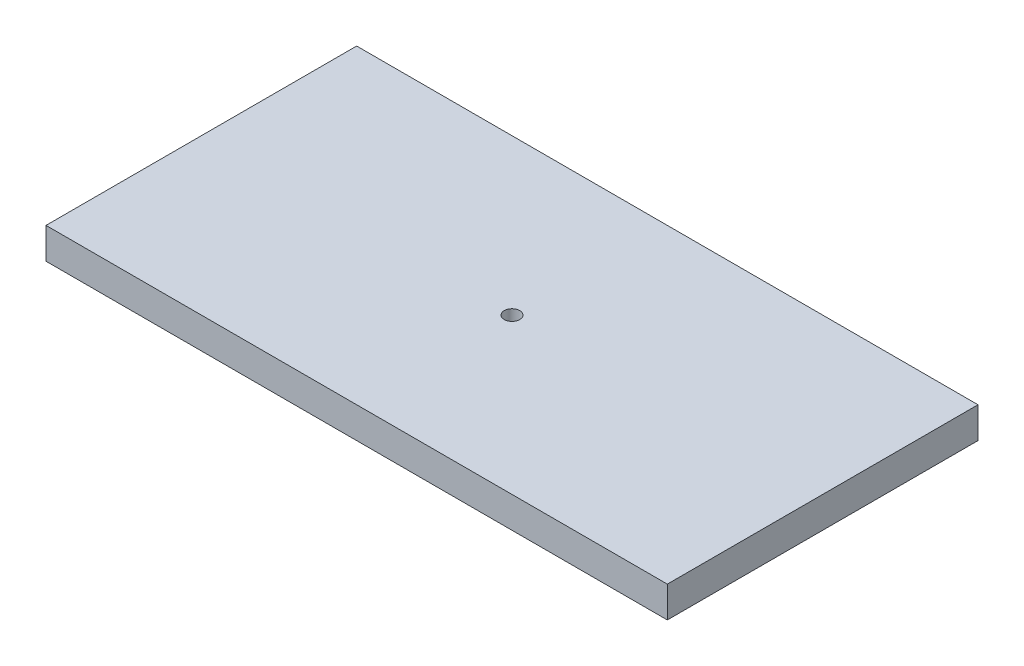
ISO-10303-21;
HEADER;
FILE_DESCRIPTION(('STEP AP214'),'2;1');
FILE_NAME('part.step','',(''),(''),'','','');
FILE_SCHEMA(('AUTOMOTIVE_DESIGN { 1 0 10303 214 1 1 1 1 }'));
ENDSEC;
DATA;
#1=APPLICATION_CONTEXT('core data for automotive mechanical design processes');
#2=APPLICATION_PROTOCOL_DEFINITION('international standard','automotive_design',2000,#1);
#3=PRODUCT_CONTEXT('',#1,'mechanical');
#4=PRODUCT('Part','Part','',(#3));
#5=PRODUCT_RELATED_PRODUCT_CATEGORY('part','',(#4));
#6=PRODUCT_DEFINITION_FORMATION('','',#4);
#7=PRODUCT_DEFINITION_CONTEXT('part definition',#1,'design');
#8=PRODUCT_DEFINITION('design','',#6,#7);
#9=PRODUCT_DEFINITION_SHAPE('','',#8);
#10=(LENGTH_UNIT() NAMED_UNIT(*) SI_UNIT(.MILLI.,.METRE.));
#11=(NAMED_UNIT(*) PLANE_ANGLE_UNIT() SI_UNIT($,.RADIAN.));
#12=(NAMED_UNIT(*) SI_UNIT($,.STERADIAN.) SOLID_ANGLE_UNIT());
#13=UNCERTAINTY_MEASURE_WITH_UNIT(LENGTH_MEASURE(1.E-05),#10,'distance_accuracy_value','');
#14=(GEOMETRIC_REPRESENTATION_CONTEXT(3) GLOBAL_UNCERTAINTY_ASSIGNED_CONTEXT((#13)) GLOBAL_UNIT_ASSIGNED_CONTEXT((#10,
#11,#12)) REPRESENTATION_CONTEXT('',''));
#15=CARTESIAN_POINT('',(0.,0.,0.));
#16=DIRECTION('',(0.,0.,1.));
#17=DIRECTION('',(1.,0.,0.));
#18=AXIS2_PLACEMENT_3D('',#15,#16,#17);
#19=CARTESIAN_POINT('',(0.,10.,0.));
#20=DIRECTION('',(1.,0.,0.));
#21=DIRECTION('',(0.,0.,-1.));
#22=AXIS2_PLACEMENT_3D('',#19,#20,#21);
#23=PLANE('',#22);
#24=DIRECTION('',(0.,0.,1.));
#25=VECTOR('',#24,1.);
#26=CARTESIAN_POINT('',(0.,0.,0.));
#27=LINE('',#26,#25);
#28=CARTESIAN_POINT('',(0.,0.,-100.));
#29=VERTEX_POINT('',#28);
#30=CARTESIAN_POINT('',(0.,0.,0.));
#31=VERTEX_POINT('',#30);
#32=EDGE_CURVE('E100',#29,#31,#27,.T.);
#33=ORIENTED_EDGE('',*,*,#32,.T.);
#34=DIRECTION('',(0.,-1.,0.));
#35=VECTOR('',#34,1.);
#36=CARTESIAN_POINT('',(0.,10.,0.));
#37=LINE('',#36,#35);
#38=CARTESIAN_POINT('',(0.,10.,0.));
#39=VERTEX_POINT('',#38);
#40=EDGE_CURVE('E11',#39,#31,#37,.T.);
#41=ORIENTED_EDGE('',*,*,#40,.F.);
#42=DIRECTION('',(0.,0.,1.));
#43=VECTOR('',#42,1.);
#44=CARTESIAN_POINT('',(0.,10.,0.));
#45=LINE('',#44,#43);
#46=CARTESIAN_POINT('',(0.,10.,-100.));
#47=VERTEX_POINT('',#46);
#48=EDGE_CURVE('E88',#47,#39,#45,.T.);
#49=ORIENTED_EDGE('',*,*,#48,.F.);
#50=DIRECTION('',(0.,-1.,0.));
#51=VECTOR('',#50,1.);
#52=CARTESIAN_POINT('',(0.,10.,-100.));
#53=LINE('',#52,#51);
#54=EDGE_CURVE('E96',#47,#29,#53,.T.);
#55=ORIENTED_EDGE('',*,*,#54,.T.);
#56=EDGE_LOOP('',(#33,#41,#49,#55));
#57=FACE_BOUND('',#56,.T.);
#58=ADVANCED_FACE('F37',(#57),#23,.F.);
#59=CARTESIAN_POINT('',(0.,10.,0.));
#60=DIRECTION('',(0.,0.,-1.));
#61=DIRECTION('',(-1.,0.,0.));
#62=AXIS2_PLACEMENT_3D('',#59,#60,#61);
#63=PLANE('',#62);
#64=DIRECTION('',(1.,0.,0.));
#65=VECTOR('',#64,1.);
#66=CARTESIAN_POINT('',(0.,0.,0.));
#67=LINE('',#66,#65);
#68=CARTESIAN_POINT('',(200.,0.,0.));
#69=VERTEX_POINT('',#68);
#70=EDGE_CURVE('E92',#31,#69,#67,.T.);
#71=ORIENTED_EDGE('',*,*,#70,.T.);
#72=DIRECTION('',(0.,-1.,0.));
#73=VECTOR('',#72,1.);
#74=CARTESIAN_POINT('',(200.,10.,0.));
#75=LINE('',#74,#73);
#76=CARTESIAN_POINT('',(200.,10.,0.));
#77=VERTEX_POINT('',#76);
#78=EDGE_CURVE('E45',#77,#69,#75,.T.);
#79=ORIENTED_EDGE('',*,*,#78,.F.);
#80=DIRECTION('',(1.,0.,0.));
#81=VECTOR('',#80,1.);
#82=CARTESIAN_POINT('',(0.,10.,0.));
#83=LINE('',#82,#81);
#84=EDGE_CURVE('E83',#39,#77,#83,.T.);
#85=ORIENTED_EDGE('',*,*,#84,.F.);
#86=ORIENTED_EDGE('',*,*,#40,.T.);
#87=EDGE_LOOP('',(#71,#79,#85,#86));
#88=FACE_BOUND('',#87,.T.);
#89=ADVANCED_FACE('F91',(#88),#63,.F.);
#90=CARTESIAN_POINT('',(200.,10.,0.));
#91=DIRECTION('',(-1.,0.,0.));
#92=DIRECTION('',(0.,0.,1.));
#93=AXIS2_PLACEMENT_3D('',#90,#91,#92);
#94=PLANE('',#93);
#95=DIRECTION('',(0.,0.,-1.));
#96=VECTOR('',#95,1.);
#97=CARTESIAN_POINT('',(200.,0.,0.));
#98=LINE('',#97,#96);
#99=CARTESIAN_POINT('',(200.,0.,-100.));
#100=VERTEX_POINT('',#99);
#101=EDGE_CURVE('E70',#69,#100,#98,.T.);
#102=ORIENTED_EDGE('',*,*,#101,.T.);
#103=DIRECTION('',(0.,-1.,0.));
#104=VECTOR('',#103,1.);
#105=CARTESIAN_POINT('',(200.,10.,-100.));
#106=LINE('',#105,#104);
#107=CARTESIAN_POINT('',(200.,10.,-100.));
#108=VERTEX_POINT('',#107);
#109=EDGE_CURVE('E93',#108,#100,#106,.T.);
#110=ORIENTED_EDGE('',*,*,#109,.F.);
#111=DIRECTION('',(0.,0.,-1.));
#112=VECTOR('',#111,1.);
#113=CARTESIAN_POINT('',(200.,10.,0.));
#114=LINE('',#113,#112);
#115=EDGE_CURVE('E86',#77,#108,#114,.T.);
#116=ORIENTED_EDGE('',*,*,#115,.F.);
#117=ORIENTED_EDGE('',*,*,#78,.T.);
#118=EDGE_LOOP('',(#102,#110,#116,#117));
#119=FACE_BOUND('',#118,.T.);
#120=ADVANCED_FACE('F94',(#119),#94,.F.);
#121=CARTESIAN_POINT('',(0.,10.,-100.));
#122=DIRECTION('',(0.,0.,1.));
#123=DIRECTION('',(1.,0.,0.));
#124=AXIS2_PLACEMENT_3D('',#121,#122,#123);
#125=PLANE('',#124);
#126=DIRECTION('',(-1.,0.,0.));
#127=VECTOR('',#126,1.);
#128=CARTESIAN_POINT('',(0.,0.,-100.));
#129=LINE('',#128,#127);
#130=EDGE_CURVE('E76',#100,#29,#129,.T.);
#131=ORIENTED_EDGE('',*,*,#130,.T.);
#132=ORIENTED_EDGE('',*,*,#54,.F.);
#133=DIRECTION('',(-1.,0.,0.));
#134=VECTOR('',#133,1.);
#135=CARTESIAN_POINT('',(0.,10.,-100.));
#136=LINE('',#135,#134);
#137=EDGE_CURVE('E53',#108,#47,#136,.T.);
#138=ORIENTED_EDGE('',*,*,#137,.F.);
#139=ORIENTED_EDGE('',*,*,#109,.T.);
#140=EDGE_LOOP('',(#131,#132,#138,#139));
#141=FACE_BOUND('',#140,.T.);
#142=ADVANCED_FACE('F108',(#141),#125,.F.);
#143=CARTESIAN_POINT('',(0.,10.,0.));
#144=DIRECTION('',(0.,-1.,0.));
#145=DIRECTION('',(0.,0.,-1.));
#146=AXIS2_PLACEMENT_3D('',#143,#144,#145);
#147=PLANE('',#146);
#148=CARTESIAN_POINT('',(100.,10.,-50.));
#149=DIRECTION('',(0.,1.,0.));
#150=DIRECTION('',(0.,0.,1.));
#151=AXIS2_PLACEMENT_3D('',#148,#149,#150);
#152=CIRCLE('',#151,2.5);
#153=CARTESIAN_POINT('',(100.,10.,-47.5));
#154=VERTEX_POINT('',#153);
#155=EDGE_CURVE('E114',#154,#154,#152,.T.);
#156=ORIENTED_EDGE('',*,*,#155,.F.);
#157=EDGE_LOOP('',(#156));
#158=FACE_BOUND('',#157,.T.);
#159=ORIENTED_EDGE('',*,*,#48,.T.);
#160=ORIENTED_EDGE('',*,*,#84,.T.);
#161=ORIENTED_EDGE('',*,*,#115,.T.);
#162=ORIENTED_EDGE('',*,*,#137,.T.);
#163=EDGE_LOOP('',(#159,#160,#161,#162));
#164=FACE_BOUND('',#163,.T.);
#165=ADVANCED_FACE('F84',(#158,#164),#147,.F.);
#166=CARTESIAN_POINT('',(0.,0.,0.));
#167=DIRECTION('',(0.,-1.,0.));
#168=DIRECTION('',(0.,0.,-1.));
#169=AXIS2_PLACEMENT_3D('',#166,#167,#168);
#170=PLANE('',#169);
#171=ORIENTED_EDGE('',*,*,#32,.F.);
#172=ORIENTED_EDGE('',*,*,#130,.F.);
#173=ORIENTED_EDGE('',*,*,#101,.F.);
#174=ORIENTED_EDGE('',*,*,#70,.F.);
#175=EDGE_LOOP('',(#171,#172,#173,#174));
#176=FACE_BOUND('',#175,.T.);
#177=ADVANCED_FACE('F111',(#176),#170,.T.);
#178=CARTESIAN_POINT('',(100.,5.,-50.));
#179=DIRECTION('',(0.,1.,0.));
#180=DIRECTION('',(0.,0.,1.));
#181=AXIS2_PLACEMENT_3D('',#178,#179,#180);
#182=CYLINDRICAL_SURFACE('',#181,2.5);
#183=CARTESIAN_POINT('',(100.,5.,-50.));
#184=DIRECTION('',(0.,1.,0.));
#185=DIRECTION('',(0.,0.,1.));
#186=AXIS2_PLACEMENT_3D('',#183,#184,#185);
#187=CIRCLE('',#186,2.5);
#188=CARTESIAN_POINT('',(100.,5.,-47.5));
#189=VERTEX_POINT('',#188);
#190=EDGE_CURVE('E103',#189,#189,#187,.T.);
#191=ORIENTED_EDGE('',*,*,#190,.F.);
#192=EDGE_LOOP('',(#191));
#193=FACE_BOUND('',#192,.T.);
#194=ORIENTED_EDGE('',*,*,#155,.T.);
#195=EDGE_LOOP('',(#194));
#196=FACE_BOUND('',#195,.T.);
#197=ADVANCED_FACE('F122',(#193,#196),#182,.F.);
#198=CARTESIAN_POINT('',(100.,5.,-50.));
#199=DIRECTION('',(0.,1.,0.));
#200=DIRECTION('',(0.,0.,1.));
#201=AXIS2_PLACEMENT_3D('',#198,#199,#200);
#202=PLANE('',#201);
#203=ORIENTED_EDGE('',*,*,#190,.T.);
#204=EDGE_LOOP('',(#203));
#205=FACE_BOUND('',#204,.T.);
#206=ADVANCED_FACE('F120',(#205),#202,.T.);
#207=CLOSED_SHELL('',(#58,#89,#120,#142,#165,#177,#197,#206));
#208=MANIFOLD_SOLID_BREP('B2',#207);
#209=ADVANCED_BREP_SHAPE_REPRESENTATION('',(#18,#208),#14);
#210=SHAPE_DEFINITION_REPRESENTATION(#9,#209);
ENDSEC;
END-ISO-10303-21;
